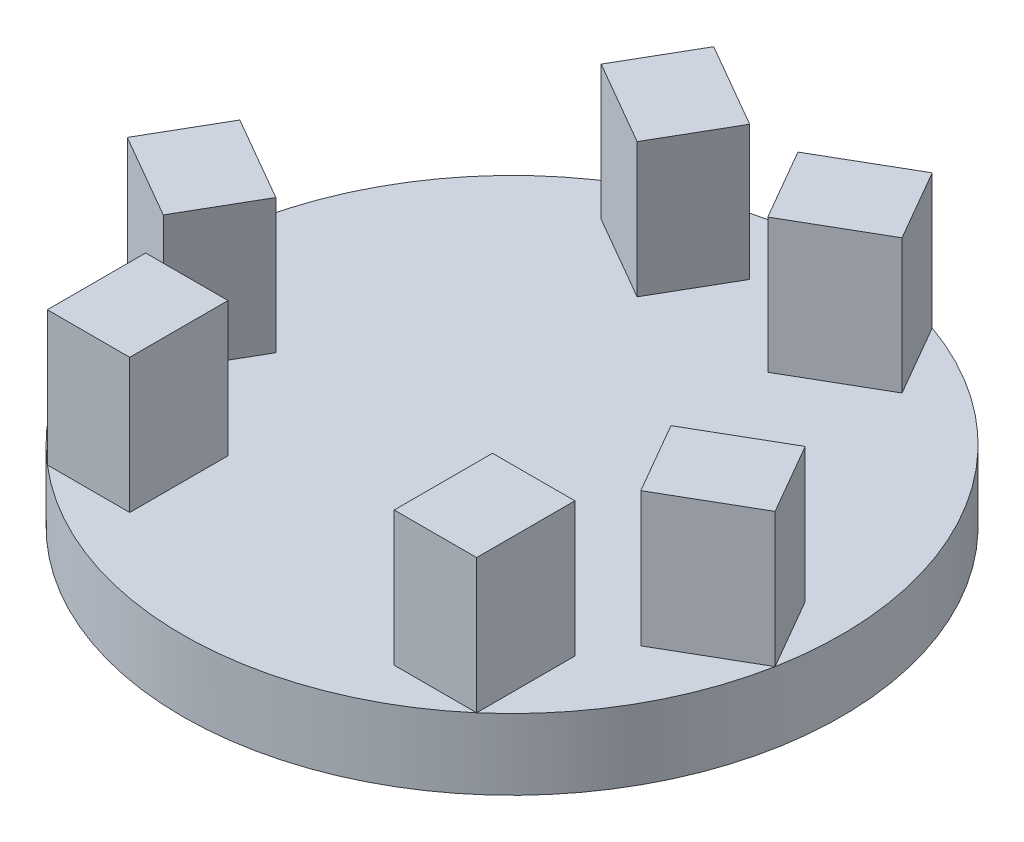
ISO-10303-21;
HEADER;
FILE_DESCRIPTION(('STEP AP214'),'2;1');
FILE_NAME('part.step','',(''),(''),'','','');
FILE_SCHEMA(('AUTOMOTIVE_DESIGN { 1 0 10303 214 1 1 1 1 }'));
ENDSEC;
DATA;
#1=APPLICATION_CONTEXT('core data for automotive mechanical design processes');
#2=APPLICATION_PROTOCOL_DEFINITION('international standard','automotive_design',2000,#1);
#3=PRODUCT_CONTEXT('',#1,'mechanical');
#4=PRODUCT('Part','Part','',(#3));
#5=PRODUCT_RELATED_PRODUCT_CATEGORY('part','',(#4));
#6=PRODUCT_DEFINITION_FORMATION('','',#4);
#7=PRODUCT_DEFINITION_CONTEXT('part definition',#1,'design');
#8=PRODUCT_DEFINITION('design','',#6,#7);
#9=PRODUCT_DEFINITION_SHAPE('','',#8);
#10=(LENGTH_UNIT() NAMED_UNIT(*) SI_UNIT(.MILLI.,.METRE.));
#11=(NAMED_UNIT(*) PLANE_ANGLE_UNIT() SI_UNIT($,.RADIAN.));
#12=(NAMED_UNIT(*) SI_UNIT($,.STERADIAN.) SOLID_ANGLE_UNIT());
#13=UNCERTAINTY_MEASURE_WITH_UNIT(LENGTH_MEASURE(1.E-05),#10,'distance_accuracy_value','');
#14=(GEOMETRIC_REPRESENTATION_CONTEXT(3) GLOBAL_UNCERTAINTY_ASSIGNED_CONTEXT((#13)) GLOBAL_UNIT_ASSIGNED_CONTEXT((#10,
#11,#12)) REPRESENTATION_CONTEXT('',''));
#15=CARTESIAN_POINT('',(0.,0.,0.));
#16=DIRECTION('',(0.,0.,1.));
#17=DIRECTION('',(1.,0.,0.));
#18=AXIS2_PLACEMENT_3D('',#15,#16,#17);
#19=CARTESIAN_POINT('',(0.,24.5,0.));
#20=DIRECTION('',(0.,1.,0.));
#21=DIRECTION('',(0.,0.,1.));
#22=AXIS2_PLACEMENT_3D('',#19,#20,#21);
#23=PLANE('',#22);
#24=DIRECTION('',(0.866025403784438,0.,-0.500000000000001));
#25=VECTOR('',#24,1.);
#26=CARTESIAN_POINT('',(22.5947751945729,24.5,-65.8726491717165));
#27=LINE('',#26,#25);
#28=CARTESIAN_POINT('',(22.5947751945729,24.5,-65.8726491717165));
#29=VERTEX_POINT('',#28);
#30=CARTESIAN_POINT('',(52.0396389232438,24.5,-82.8726491717165));
#31=VERTEX_POINT('',#30);
#32=EDGE_CURVE('E794',#29,#31,#27,.T.);
#33=ORIENTED_EDGE('',*,*,#32,.F.);
#34=DIRECTION('',(0.500000000000001,0.,0.866025403784438));
#35=VECTOR('',#34,1.);
#36=CARTESIAN_POINT('',(22.5947751945729,24.5,-65.8726491717165));
#37=LINE('',#36,#35);
#38=CARTESIAN_POINT('',(8.34477519457285,24.5,-90.554373179573));
#39=VERTEX_POINT('',#38);
#40=EDGE_CURVE('E229',#39,#29,#37,.T.);
#41=ORIENTED_EDGE('',*,*,#40,.F.);
#42=DIRECTION('',(-0.866025403784438,0.,0.500000000000001));
#43=VECTOR('',#42,1.);
#44=CARTESIAN_POINT('',(8.34477519457285,24.5,-90.554373179573));
#45=LINE('',#44,#43);
#46=CARTESIAN_POINT('',(37.7896389232437,24.5,-107.554373179573));
#47=VERTEX_POINT('',#46);
#48=EDGE_CURVE('E225',#47,#39,#45,.T.);
#49=ORIENTED_EDGE('',*,*,#48,.F.);
#50=CARTESIAN_POINT('',(0.,24.5,0.));
#51=DIRECTION('',(0.,1.,0.));
#52=DIRECTION('',(0.,0.,1.));
#53=AXIS2_PLACEMENT_3D('',#50,#51,#52);
#54=CIRCLE('',#53,114.);
#55=CARTESIAN_POINT('',(-37.7896389232438,24.5,-107.554373179573));
#56=VERTEX_POINT('',#55);
#57=EDGE_CURVE('E50',#47,#56,#54,.T.);
#58=ORIENTED_EDGE('',*,*,#57,.T.);
#59=DIRECTION('',(-0.866025403784439,0.,-0.5));
#60=VECTOR('',#59,1.);
#61=CARTESIAN_POINT('',(-8.34477519457291,24.5,-90.554373179573));
#62=LINE('',#61,#60);
#63=CARTESIAN_POINT('',(-8.34477519457291,24.5,-90.554373179573));
#64=VERTEX_POINT('',#63);
#65=EDGE_CURVE('E336',#64,#56,#62,.T.);
#66=ORIENTED_EDGE('',*,*,#65,.F.);
#67=DIRECTION('',(0.5,0.,-0.866025403784439));
#68=VECTOR('',#67,1.);
#69=CARTESIAN_POINT('',(-8.34477519457291,24.5,-90.554373179573));
#70=LINE('',#69,#68);
#71=CARTESIAN_POINT('',(-22.5947751945729,24.5,-65.8726491717165));
#72=VERTEX_POINT('',#71);
#73=EDGE_CURVE('E317',#72,#64,#70,.T.);
#74=ORIENTED_EDGE('',*,*,#73,.F.);
#75=DIRECTION('',(0.866025403784439,0.,0.5));
#76=VECTOR('',#75,1.);
#77=CARTESIAN_POINT('',(-22.5947751945729,24.5,-65.8726491717165));
#78=LINE('',#77,#76);
#79=CARTESIAN_POINT('',(-52.0396389232438,24.5,-82.8726491717165));
#80=VERTEX_POINT('',#79);
#81=EDGE_CURVE('E323',#80,#72,#78,.T.);
#82=ORIENTED_EDGE('',*,*,#81,.F.);
#83=DIRECTION('',(-0.5,0.,0.866025403784439));
#84=VECTOR('',#83,1.);
#85=CARTESIAN_POINT('',(-37.7896389232438,24.5,-107.554373179573));
#86=LINE('',#85,#84);
#87=EDGE_CURVE('E340',#56,#80,#86,.T.);
#88=ORIENTED_EDGE('',*,*,#87,.F.);
#89=CARTESIAN_POINT('',(-112.039638923244,24.5,21.0503992824162));
#90=VERTEX_POINT('',#89);
#91=EDGE_CURVE('E452',#56,#90,#54,.T.);
#92=ORIENTED_EDGE('',*,*,#91,.T.);
#93=DIRECTION('',(-0.5,0.,0.866025403784439));
#94=VECTOR('',#93,1.);
#95=CARTESIAN_POINT('',(-97.7896389232438,24.5,-3.63132472544033));
#96=LINE('',#95,#94);
#97=CARTESIAN_POINT('',(-97.7896389232438,24.5,-3.63132472544033));
#98=VERTEX_POINT('',#97);
#99=EDGE_CURVE('E298',#98,#90,#96,.T.);
#100=ORIENTED_EDGE('',*,*,#99,.F.);
#101=DIRECTION('',(-0.866025403784439,0.,-0.5));
#102=VECTOR('',#101,1.);
#103=CARTESIAN_POINT('',(-68.3447751945729,24.5,13.3686752745597));
#104=LINE('',#103,#102);
#105=CARTESIAN_POINT('',(-68.3447751945729,24.5,13.3686752745597));
#106=VERTEX_POINT('',#105);
#107=EDGE_CURVE('E295',#106,#98,#104,.T.);
#108=ORIENTED_EDGE('',*,*,#107,.F.);
#109=DIRECTION('',(0.5,0.,-0.866025403784439));
#110=VECTOR('',#109,1.);
#111=CARTESIAN_POINT('',(-68.3447751945729,24.5,13.3686752745597));
#112=LINE('',#111,#110);
#113=CARTESIAN_POINT('',(-82.5947751945729,24.5,38.0503992824162));
#114=VERTEX_POINT('',#113);
#115=EDGE_CURVE('E276',#114,#106,#112,.T.);
#116=ORIENTED_EDGE('',*,*,#115,.F.);
#117=DIRECTION('',(0.866025403784439,0.,0.5));
#118=VECTOR('',#117,1.);
#119=CARTESIAN_POINT('',(-82.5947751945729,24.5,38.0503992824162));
#120=LINE('',#119,#118);
#121=EDGE_CURVE('E282',#90,#114,#120,.T.);
#122=ORIENTED_EDGE('',*,*,#121,.F.);
#123=CARTESIAN_POINT('',(-74.25,24.5,86.5039738971569));
#124=VERTEX_POINT('',#123);
#125=EDGE_CURVE('E448',#90,#124,#54,.T.);
#126=ORIENTED_EDGE('',*,*,#125,.T.);
#127=DIRECTION('',(0.,0.,1.));
#128=VECTOR('',#127,1.);
#129=CARTESIAN_POINT('',(-74.25,24.5,52.5039738971569));
#130=LINE('',#129,#128);
#131=CARTESIAN_POINT('',(-74.25,24.5,52.5039738971569));
#132=VERTEX_POINT('',#131);
#133=EDGE_CURVE('E400',#132,#124,#130,.T.);
#134=ORIENTED_EDGE('',*,*,#133,.F.);
#135=DIRECTION('',(-1.,0.,0.));
#136=VECTOR('',#135,1.);
#137=CARTESIAN_POINT('',(-74.25,24.5,52.5039738971569));
#138=LINE('',#137,#136);
#139=CARTESIAN_POINT('',(-45.75,24.5,52.5039738971569));
#140=VERTEX_POINT('',#139);
#141=EDGE_CURVE('E406',#140,#132,#138,.T.);
#142=ORIENTED_EDGE('',*,*,#141,.F.);
#143=DIRECTION('',(0.,0.,-1.));
#144=VECTOR('',#143,1.);
#145=CARTESIAN_POINT('',(-45.75,24.5,52.5039738971569));
#146=LINE('',#145,#144);
#147=CARTESIAN_POINT('',(-45.75,24.5,86.5039738971569));
#148=VERTEX_POINT('',#147);
#149=EDGE_CURVE('E423',#148,#140,#146,.T.);
#150=ORIENTED_EDGE('',*,*,#149,.F.);
#151=DIRECTION('',(1.,0.,0.));
#152=VECTOR('',#151,1.);
#153=CARTESIAN_POINT('',(-74.25,24.5,86.5039738971569));
#154=LINE('',#153,#152);
#155=EDGE_CURVE('E419',#124,#148,#154,.T.);
#156=ORIENTED_EDGE('',*,*,#155,.F.);
#157=CARTESIAN_POINT('',(74.25,24.5,86.5039738971569));
#158=VERTEX_POINT('',#157);
#159=EDGE_CURVE('E11',#124,#158,#54,.T.);
#160=ORIENTED_EDGE('',*,*,#159,.T.);
#161=DIRECTION('',(1.,0.,0.));
#162=VECTOR('',#161,1.);
#163=CARTESIAN_POINT('',(45.75,24.5,86.5039738971569));
#164=LINE('',#163,#162);
#165=CARTESIAN_POINT('',(45.75,24.5,86.5039738971569));
#166=VERTEX_POINT('',#165);
#167=EDGE_CURVE('E378',#166,#158,#164,.T.);
#168=ORIENTED_EDGE('',*,*,#167,.F.);
#169=DIRECTION('',(0.,0.,1.));
#170=VECTOR('',#169,1.);
#171=CARTESIAN_POINT('',(45.75,24.5,52.5039738971569));
#172=LINE('',#171,#170);
#173=CARTESIAN_POINT('',(45.75,24.5,52.5039738971569));
#174=VERTEX_POINT('',#173);
#175=EDGE_CURVE('E359',#174,#166,#172,.T.);
#176=ORIENTED_EDGE('',*,*,#175,.F.);
#177=DIRECTION('',(-1.,0.,0.));
#178=VECTOR('',#177,1.);
#179=CARTESIAN_POINT('',(45.75,24.5,52.5039738971569));
#180=LINE('',#179,#178);
#181=CARTESIAN_POINT('',(74.25,24.5,52.5039738971569));
#182=VERTEX_POINT('',#181);
#183=EDGE_CURVE('E365',#182,#174,#180,.T.);
#184=ORIENTED_EDGE('',*,*,#183,.F.);
#185=DIRECTION('',(0.,0.,-1.));
#186=VECTOR('',#185,1.);
#187=CARTESIAN_POINT('',(74.25,24.5,52.5039738971569));
#188=LINE('',#187,#186);
#189=EDGE_CURVE('E381',#158,#182,#188,.T.);
#190=ORIENTED_EDGE('',*,*,#189,.F.);
#191=CARTESIAN_POINT('',(112.039638923244,24.5,21.0503992824161));
#192=VERTEX_POINT('',#191);
#193=EDGE_CURVE('E49',#158,#192,#54,.T.);
#194=ORIENTED_EDGE('',*,*,#193,.T.);
#195=DIRECTION('',(0.866025403784438,0.,-0.5));
#196=VECTOR('',#195,1.);
#197=CARTESIAN_POINT('',(82.5947751945729,24.5,38.0503992824161));
#198=LINE('',#197,#196);
#199=CARTESIAN_POINT('',(82.5947751945729,24.5,38.0503992824161));
#200=VERTEX_POINT('',#199);
#201=EDGE_CURVE('E237',#200,#192,#198,.T.);
#202=ORIENTED_EDGE('',*,*,#201,.F.);
#203=DIRECTION('',(0.5,0.,0.866025403784438));
#204=VECTOR('',#203,1.);
#205=CARTESIAN_POINT('',(82.5947751945729,24.5,38.0503992824161));
#206=LINE('',#205,#204);
#207=CARTESIAN_POINT('',(68.3447751945729,24.5,13.3686752745596));
#208=VERTEX_POINT('',#207);
#209=EDGE_CURVE('E232',#208,#200,#206,.T.);
#210=ORIENTED_EDGE('',*,*,#209,.F.);
#211=DIRECTION('',(-0.866025403784438,0.,0.5));
#212=VECTOR('',#211,1.);
#213=CARTESIAN_POINT('',(68.3447751945729,24.5,13.3686752745596));
#214=LINE('',#213,#212);
#215=CARTESIAN_POINT('',(97.7896389232438,24.5,-3.6313247254404));
#216=VERTEX_POINT('',#215);
#217=EDGE_CURVE('E247',#216,#208,#214,.T.);
#218=ORIENTED_EDGE('',*,*,#217,.F.);
#219=DIRECTION('',(-0.500000000000001,0.,-0.866025403784438));
#220=VECTOR('',#219,1.);
#221=CARTESIAN_POINT('',(112.039638923244,24.5,21.0503992824161));
#222=LINE('',#221,#220);
#223=EDGE_CURVE('E259',#192,#216,#222,.T.);
#224=ORIENTED_EDGE('',*,*,#223,.F.);
#225=EDGE_CURVE('E453',#192,#47,#54,.T.);
#226=ORIENTED_EDGE('',*,*,#225,.T.);
#227=DIRECTION('',(-0.500000000000001,0.,-0.866025403784438));
#228=VECTOR('',#227,1.);
#229=CARTESIAN_POINT('',(52.0396389232438,24.5,-82.8726491717165));
#230=LINE('',#229,#228);
#231=EDGE_CURVE('E790',#31,#47,#230,.T.);
#232=ORIENTED_EDGE('',*,*,#231,.F.);
#233=EDGE_LOOP('',(#33,#41,#49,#58,#66,#74,#82,#88,#92,#100,#108,#116,#122,#126,#134,#142,#150,
#156,#160,#168,#176,#184,#190,#194,#202,#210,#218,#224,#226,#232));
#234=FACE_BOUND('',#233,.T.);
#235=ADVANCED_FACE('F39',(#234),#23,.T.);
#236=CARTESIAN_POINT('',(0.,24.5,0.));
#237=DIRECTION('',(0.,-1.,0.));
#238=DIRECTION('',(0.,0.,-1.));
#239=AXIS2_PLACEMENT_3D('',#236,#237,#238);
#240=CYLINDRICAL_SURFACE('',#239,114.);
#241=ORIENTED_EDGE('',*,*,#159,.F.);
#242=ORIENTED_EDGE('',*,*,#125,.F.);
#243=ORIENTED_EDGE('',*,*,#91,.F.);
#244=ORIENTED_EDGE('',*,*,#57,.F.);
#245=ORIENTED_EDGE('',*,*,#225,.F.);
#246=ORIENTED_EDGE('',*,*,#193,.F.);
#247=EDGE_LOOP('',(#241,#242,#243,#244,#245,#246));
#248=FACE_BOUND('',#247,.T.);
#249=CARTESIAN_POINT('',(0.,0.,0.));
#250=DIRECTION('',(0.,1.,0.));
#251=DIRECTION('',(0.,0.,1.));
#252=AXIS2_PLACEMENT_3D('',#249,#250,#251);
#253=CIRCLE('',#252,114.);
#254=CARTESIAN_POINT('',(0.,0.,114.));
#255=VERTEX_POINT('',#254);
#256=EDGE_CURVE('E43',#255,#255,#253,.T.);
#257=ORIENTED_EDGE('',*,*,#256,.T.);
#258=EDGE_LOOP('',(#257));
#259=FACE_BOUND('',#258,.T.);
#260=ADVANCED_FACE('F41',(#248,#259),#240,.T.);
#261=CARTESIAN_POINT('',(0.,0.,0.));
#262=DIRECTION('',(0.,1.,0.));
#263=DIRECTION('',(0.,0.,1.));
#264=AXIS2_PLACEMENT_3D('',#261,#262,#263);
#265=PLANE('',#264);
#266=ORIENTED_EDGE('',*,*,#256,.F.);
#267=EDGE_LOOP('',(#266));
#268=FACE_BOUND('',#267,.T.);
#269=ADVANCED_FACE('F519',(#268),#265,.F.);
#270=CARTESIAN_POINT('',(-74.25,71.,52.5039738971569));
#271=DIRECTION('',(1.,0.,0.));
#272=DIRECTION('',(0.,0.,-1.));
#273=AXIS2_PLACEMENT_3D('',#270,#271,#272);
#274=PLANE('',#273);
#275=ORIENTED_EDGE('',*,*,#133,.T.);
#276=DIRECTION('',(0.,-1.,0.));
#277=VECTOR('',#276,1.);
#278=CARTESIAN_POINT('',(-74.25,71.,86.5039738971569));
#279=LINE('',#278,#277);
#280=CARTESIAN_POINT('',(-74.25,71.,86.5039738971569));
#281=VERTEX_POINT('',#280);
#282=EDGE_CURVE('E441',#281,#124,#279,.T.);
#283=ORIENTED_EDGE('',*,*,#282,.F.);
#284=DIRECTION('',(0.,0.,1.));
#285=VECTOR('',#284,1.);
#286=CARTESIAN_POINT('',(-74.25,71.,52.5039738971569));
#287=LINE('',#286,#285);
#288=CARTESIAN_POINT('',(-74.25,71.,52.5039738971569));
#289=VERTEX_POINT('',#288);
#290=EDGE_CURVE('E401',#289,#281,#287,.T.);
#291=ORIENTED_EDGE('',*,*,#290,.F.);
#292=DIRECTION('',(0.,-1.,0.));
#293=VECTOR('',#292,1.);
#294=CARTESIAN_POINT('',(-74.25,71.,52.5039738971569));
#295=LINE('',#294,#293);
#296=EDGE_CURVE('E415',#289,#132,#295,.T.);
#297=ORIENTED_EDGE('',*,*,#296,.T.);
#298=EDGE_LOOP('',(#275,#283,#291,#297));
#299=FACE_BOUND('',#298,.T.);
#300=ADVANCED_FACE('F501',(#299),#274,.F.);
#301=CARTESIAN_POINT('',(-74.25,71.,86.5039738971569));
#302=DIRECTION('',(0.,0.,-1.));
#303=DIRECTION('',(-1.,0.,0.));
#304=AXIS2_PLACEMENT_3D('',#301,#302,#303);
#305=PLANE('',#304);
#306=ORIENTED_EDGE('',*,*,#155,.T.);
#307=DIRECTION('',(0.,-1.,0.));
#308=VECTOR('',#307,1.);
#309=CARTESIAN_POINT('',(-45.75,71.,86.5039738971569));
#310=LINE('',#309,#308);
#311=CARTESIAN_POINT('',(-45.75,71.,86.5039738971569));
#312=VERTEX_POINT('',#311);
#313=EDGE_CURVE('E437',#312,#148,#310,.T.);
#314=ORIENTED_EDGE('',*,*,#313,.F.);
#315=DIRECTION('',(1.,0.,0.));
#316=VECTOR('',#315,1.);
#317=CARTESIAN_POINT('',(-74.25,71.,86.5039738971569));
#318=LINE('',#317,#316);
#319=EDGE_CURVE('E405',#281,#312,#318,.T.);
#320=ORIENTED_EDGE('',*,*,#319,.F.);
#321=ORIENTED_EDGE('',*,*,#282,.T.);
#322=EDGE_LOOP('',(#306,#314,#320,#321));
#323=FACE_BOUND('',#322,.T.);
#324=ADVANCED_FACE('F490',(#323),#305,.F.);
#325=CARTESIAN_POINT('',(-45.75,71.,52.5039738971569));
#326=DIRECTION('',(-1.,0.,0.));
#327=DIRECTION('',(0.,0.,1.));
#328=AXIS2_PLACEMENT_3D('',#325,#326,#327);
#329=PLANE('',#328);
#330=ORIENTED_EDGE('',*,*,#149,.T.);
#331=DIRECTION('',(0.,-1.,0.));
#332=VECTOR('',#331,1.);
#333=CARTESIAN_POINT('',(-45.75,71.,52.5039738971569));
#334=LINE('',#333,#332);
#335=CARTESIAN_POINT('',(-45.75,71.,52.5039738971569));
#336=VERTEX_POINT('',#335);
#337=EDGE_CURVE('E433',#336,#140,#334,.T.);
#338=ORIENTED_EDGE('',*,*,#337,.F.);
#339=DIRECTION('',(0.,0.,-1.));
#340=VECTOR('',#339,1.);
#341=CARTESIAN_POINT('',(-45.75,71.,52.5039738971569));
#342=LINE('',#341,#340);
#343=EDGE_CURVE('E409',#312,#336,#342,.T.);
#344=ORIENTED_EDGE('',*,*,#343,.F.);
#345=ORIENTED_EDGE('',*,*,#313,.T.);
#346=EDGE_LOOP('',(#330,#338,#344,#345));
#347=FACE_BOUND('',#346,.T.);
#348=ADVANCED_FACE('F493',(#347),#329,.F.);
#349=CARTESIAN_POINT('',(-74.25,71.,52.5039738971569));
#350=DIRECTION('',(0.,0.,1.));
#351=DIRECTION('',(1.,0.,0.));
#352=AXIS2_PLACEMENT_3D('',#349,#350,#351);
#353=PLANE('',#352);
#354=ORIENTED_EDGE('',*,*,#141,.T.);
#355=ORIENTED_EDGE('',*,*,#296,.F.);
#356=DIRECTION('',(-1.,0.,0.));
#357=VECTOR('',#356,1.);
#358=CARTESIAN_POINT('',(-74.25,71.,52.5039738971569));
#359=LINE('',#358,#357);
#360=EDGE_CURVE('E412',#336,#289,#359,.T.);
#361=ORIENTED_EDGE('',*,*,#360,.F.);
#362=ORIENTED_EDGE('',*,*,#337,.T.);
#363=EDGE_LOOP('',(#354,#355,#361,#362));
#364=FACE_BOUND('',#363,.T.);
#365=ADVANCED_FACE('F503',(#364),#353,.F.);
#366=CARTESIAN_POINT('',(0.,71.,0.));
#367=DIRECTION('',(0.,1.,0.));
#368=DIRECTION('',(0.,0.,1.));
#369=AXIS2_PLACEMENT_3D('',#366,#367,#368);
#370=PLANE('',#369);
#371=ORIENTED_EDGE('',*,*,#290,.T.);
#372=ORIENTED_EDGE('',*,*,#319,.T.);
#373=ORIENTED_EDGE('',*,*,#343,.T.);
#374=ORIENTED_EDGE('',*,*,#360,.T.);
#375=EDGE_LOOP('',(#371,#372,#373,#374));
#376=FACE_BOUND('',#375,.T.);
#377=ADVANCED_FACE('F497',(#376),#370,.T.);
#378=CARTESIAN_POINT('',(45.75,71.,52.5039738971569));
#379=DIRECTION('',(1.,0.,0.));
#380=DIRECTION('',(0.,0.,-1.));
#381=AXIS2_PLACEMENT_3D('',#378,#379,#380);
#382=PLANE('',#381);
#383=ORIENTED_EDGE('',*,*,#175,.T.);
#384=DIRECTION('',(0.,-1.,0.));
#385=VECTOR('',#384,1.);
#386=CARTESIAN_POINT('',(45.75,71.,86.5039738971569));
#387=LINE('',#386,#385);
#388=CARTESIAN_POINT('',(45.75,71.,86.5039738971569));
#389=VERTEX_POINT('',#388);
#390=EDGE_CURVE('E397',#389,#166,#387,.T.);
#391=ORIENTED_EDGE('',*,*,#390,.F.);
#392=DIRECTION('',(0.,0.,1.));
#393=VECTOR('',#392,1.);
#394=CARTESIAN_POINT('',(45.75,71.,52.5039738971569));
#395=LINE('',#394,#393);
#396=CARTESIAN_POINT('',(45.75,71.,52.5039738971569));
#397=VERTEX_POINT('',#396);
#398=EDGE_CURVE('E360',#397,#389,#395,.T.);
#399=ORIENTED_EDGE('',*,*,#398,.F.);
#400=DIRECTION('',(0.,-1.,0.));
#401=VECTOR('',#400,1.);
#402=CARTESIAN_POINT('',(45.75,71.,52.5039738971569));
#403=LINE('',#402,#401);
#404=EDGE_CURVE('E374',#397,#174,#403,.T.);
#405=ORIENTED_EDGE('',*,*,#404,.T.);
#406=EDGE_LOOP('',(#383,#391,#399,#405));
#407=FACE_BOUND('',#406,.T.);
#408=ADVANCED_FACE('F510',(#407),#382,.F.);
#409=CARTESIAN_POINT('',(45.75,71.,86.5039738971569));
#410=DIRECTION('',(0.,0.,-1.));
#411=DIRECTION('',(-1.,0.,0.));
#412=AXIS2_PLACEMENT_3D('',#409,#410,#411);
#413=PLANE('',#412);
#414=ORIENTED_EDGE('',*,*,#167,.T.);
#415=DIRECTION('',(0.,-1.,0.));
#416=VECTOR('',#415,1.);
#417=CARTESIAN_POINT('',(74.25,71.,86.5039738971569));
#418=LINE('',#417,#416);
#419=CARTESIAN_POINT('',(74.25,71.,86.5039738971569));
#420=VERTEX_POINT('',#419);
#421=EDGE_CURVE('E393',#420,#158,#418,.T.);
#422=ORIENTED_EDGE('',*,*,#421,.F.);
#423=DIRECTION('',(1.,0.,0.));
#424=VECTOR('',#423,1.);
#425=CARTESIAN_POINT('',(45.75,71.,86.5039738971569));
#426=LINE('',#425,#424);
#427=EDGE_CURVE('E364',#389,#420,#426,.T.);
#428=ORIENTED_EDGE('',*,*,#427,.F.);
#429=ORIENTED_EDGE('',*,*,#390,.T.);
#430=EDGE_LOOP('',(#414,#422,#428,#429));
#431=FACE_BOUND('',#430,.T.);
#432=ADVANCED_FACE('F556',(#431),#413,.F.);
#433=CARTESIAN_POINT('',(74.25,71.,52.5039738971569));
#434=DIRECTION('',(-1.,0.,0.));
#435=DIRECTION('',(0.,0.,1.));
#436=AXIS2_PLACEMENT_3D('',#433,#434,#435);
#437=PLANE('',#436);
#438=ORIENTED_EDGE('',*,*,#189,.T.);
#439=DIRECTION('',(0.,-1.,0.));
#440=VECTOR('',#439,1.);
#441=CARTESIAN_POINT('',(74.25,71.,52.5039738971569));
#442=LINE('',#441,#440);
#443=CARTESIAN_POINT('',(74.25,71.,52.5039738971569));
#444=VERTEX_POINT('',#443);
#445=EDGE_CURVE('E390',#444,#182,#442,.T.);
#446=ORIENTED_EDGE('',*,*,#445,.F.);
#447=DIRECTION('',(0.,0.,-1.));
#448=VECTOR('',#447,1.);
#449=CARTESIAN_POINT('',(74.25,71.,52.5039738971569));
#450=LINE('',#449,#448);
#451=EDGE_CURVE('E368',#420,#444,#450,.T.);
#452=ORIENTED_EDGE('',*,*,#451,.F.);
#453=ORIENTED_EDGE('',*,*,#421,.T.);
#454=EDGE_LOOP('',(#438,#446,#452,#453));
#455=FACE_BOUND('',#454,.T.);
#456=ADVANCED_FACE('F566',(#455),#437,.F.);
#457=CARTESIAN_POINT('',(45.75,71.,52.5039738971569));
#458=DIRECTION('',(0.,0.,1.));
#459=DIRECTION('',(1.,0.,0.));
#460=AXIS2_PLACEMENT_3D('',#457,#458,#459);
#461=PLANE('',#460);
#462=ORIENTED_EDGE('',*,*,#183,.T.);
#463=ORIENTED_EDGE('',*,*,#404,.F.);
#464=DIRECTION('',(-1.,0.,0.));
#465=VECTOR('',#464,1.);
#466=CARTESIAN_POINT('',(45.75,71.,52.5039738971569));
#467=LINE('',#466,#465);
#468=EDGE_CURVE('E371',#444,#397,#467,.T.);
#469=ORIENTED_EDGE('',*,*,#468,.F.);
#470=ORIENTED_EDGE('',*,*,#445,.T.);
#471=EDGE_LOOP('',(#462,#463,#469,#470));
#472=FACE_BOUND('',#471,.T.);
#473=ADVANCED_FACE('F576',(#472),#461,.F.);
#474=CARTESIAN_POINT('',(0.,71.,0.));
#475=DIRECTION('',(0.,1.,0.));
#476=DIRECTION('',(0.,0.,1.));
#477=AXIS2_PLACEMENT_3D('',#474,#475,#476);
#478=PLANE('',#477);
#479=ORIENTED_EDGE('',*,*,#398,.T.);
#480=ORIENTED_EDGE('',*,*,#427,.T.);
#481=ORIENTED_EDGE('',*,*,#451,.T.);
#482=ORIENTED_EDGE('',*,*,#468,.T.);
#483=EDGE_LOOP('',(#479,#480,#481,#482));
#484=FACE_BOUND('',#483,.T.);
#485=ADVANCED_FACE('F586',(#484),#478,.T.);
#486=CARTESIAN_POINT('',(-8.34477519457291,71.,-90.554373179573));
#487=DIRECTION('',(-0.866025403784439,0.,-0.5));
#488=DIRECTION('',(-0.5,0.,0.866025403784439));
#489=AXIS2_PLACEMENT_3D('',#486,#487,#488);
#490=PLANE('',#489);
#491=ORIENTED_EDGE('',*,*,#73,.T.);
#492=DIRECTION('',(0.,-1.,0.));
#493=VECTOR('',#492,1.);
#494=CARTESIAN_POINT('',(-8.34477519457291,71.,-90.554373179573));
#495=LINE('',#494,#493);
#496=CARTESIAN_POINT('',(-8.34477519457291,71.,-90.554373179573));
#497=VERTEX_POINT('',#496);
#498=EDGE_CURVE('E356',#497,#64,#495,.T.);
#499=ORIENTED_EDGE('',*,*,#498,.F.);
#500=DIRECTION('',(0.5,0.,-0.866025403784439));
#501=VECTOR('',#500,1.);
#502=CARTESIAN_POINT('',(-8.34477519457291,71.,-90.554373179573));
#503=LINE('',#502,#501);
#504=CARTESIAN_POINT('',(-22.5947751945729,71.,-65.8726491717165));
#505=VERTEX_POINT('',#504);
#506=EDGE_CURVE('E318',#505,#497,#503,.T.);
#507=ORIENTED_EDGE('',*,*,#506,.F.);
#508=DIRECTION('',(0.,-1.,0.));
#509=VECTOR('',#508,1.);
#510=CARTESIAN_POINT('',(-22.5947751945729,71.,-65.8726491717165));
#511=LINE('',#510,#509);
#512=EDGE_CURVE('E332',#505,#72,#511,.T.);
#513=ORIENTED_EDGE('',*,*,#512,.T.);
#514=EDGE_LOOP('',(#491,#499,#507,#513));
#515=FACE_BOUND('',#514,.T.);
#516=ADVANCED_FACE('F596',(#515),#490,.F.);
#517=CARTESIAN_POINT('',(-8.34477519457291,71.,-90.554373179573));
#518=DIRECTION('',(-0.5,0.,0.866025403784439));
#519=DIRECTION('',(0.866025403784439,0.,0.5));
#520=AXIS2_PLACEMENT_3D('',#517,#518,#519);
#521=PLANE('',#520);
#522=ORIENTED_EDGE('',*,*,#65,.T.);
#523=DIRECTION('',(0.,-1.,0.));
#524=VECTOR('',#523,1.);
#525=CARTESIAN_POINT('',(-37.7896389232438,71.,-107.554373179573));
#526=LINE('',#525,#524);
#527=CARTESIAN_POINT('',(-37.7896389232438,71.,-107.554373179573));
#528=VERTEX_POINT('',#527);
#529=EDGE_CURVE('E352',#528,#56,#526,.T.);
#530=ORIENTED_EDGE('',*,*,#529,.F.);
#531=DIRECTION('',(-0.866025403784439,0.,-0.5));
#532=VECTOR('',#531,1.);
#533=CARTESIAN_POINT('',(-8.34477519457291,71.,-90.554373179573));
#534=LINE('',#533,#532);
#535=EDGE_CURVE('E322',#497,#528,#534,.T.);
#536=ORIENTED_EDGE('',*,*,#535,.F.);
#537=ORIENTED_EDGE('',*,*,#498,.T.);
#538=EDGE_LOOP('',(#522,#530,#536,#537));
#539=FACE_BOUND('',#538,.T.);
#540=ADVANCED_FACE('F476',(#539),#521,.F.);
#541=CARTESIAN_POINT('',(-37.7896389232438,71.,-107.554373179573));
#542=DIRECTION('',(0.866025403784439,0.,0.5));
#543=DIRECTION('',(0.5,0.,-0.866025403784439));
#544=AXIS2_PLACEMENT_3D('',#541,#542,#543);
#545=PLANE('',#544);
#546=ORIENTED_EDGE('',*,*,#87,.T.);
#547=DIRECTION('',(0.,-1.,0.));
#548=VECTOR('',#547,1.);
#549=CARTESIAN_POINT('',(-52.0396389232438,71.,-82.8726491717165));
#550=LINE('',#549,#548);
#551=CARTESIAN_POINT('',(-52.0396389232438,71.,-82.8726491717165));
#552=VERTEX_POINT('',#551);
#553=EDGE_CURVE('E349',#552,#80,#550,.T.);
#554=ORIENTED_EDGE('',*,*,#553,.F.);
#555=DIRECTION('',(-0.5,0.,0.866025403784439));
#556=VECTOR('',#555,1.);
#557=CARTESIAN_POINT('',(-37.7896389232438,71.,-107.554373179573));
#558=LINE('',#557,#556);
#559=EDGE_CURVE('E326',#528,#552,#558,.T.);
#560=ORIENTED_EDGE('',*,*,#559,.F.);
#561=ORIENTED_EDGE('',*,*,#529,.T.);
#562=EDGE_LOOP('',(#546,#554,#560,#561));
#563=FACE_BOUND('',#562,.T.);
#564=ADVANCED_FACE('F481',(#563),#545,.F.);
#565=CARTESIAN_POINT('',(-22.5947751945729,71.,-65.8726491717165));
#566=DIRECTION('',(0.5,0.,-0.866025403784439));
#567=DIRECTION('',(-0.866025403784439,0.,-0.5));
#568=AXIS2_PLACEMENT_3D('',#565,#566,#567);
#569=PLANE('',#568);
#570=ORIENTED_EDGE('',*,*,#81,.T.);
#571=ORIENTED_EDGE('',*,*,#512,.F.);
#572=DIRECTION('',(0.866025403784439,0.,0.5));
#573=VECTOR('',#572,1.);
#574=CARTESIAN_POINT('',(-22.5947751945729,71.,-65.8726491717165));
#575=LINE('',#574,#573);
#576=EDGE_CURVE('E329',#552,#505,#575,.T.);
#577=ORIENTED_EDGE('',*,*,#576,.F.);
#578=ORIENTED_EDGE('',*,*,#553,.T.);
#579=EDGE_LOOP('',(#570,#571,#577,#578));
#580=FACE_BOUND('',#579,.T.);
#581=ADVANCED_FACE('F623',(#580),#569,.F.);
#582=CARTESIAN_POINT('',(0.,71.,0.));
#583=DIRECTION('',(0.,-1.,0.));
#584=DIRECTION('',(0.,0.,-1.));
#585=AXIS2_PLACEMENT_3D('',#582,#583,#584);
#586=PLANE('',#585);
#587=ORIENTED_EDGE('',*,*,#506,.T.);
#588=ORIENTED_EDGE('',*,*,#535,.T.);
#589=ORIENTED_EDGE('',*,*,#559,.T.);
#590=ORIENTED_EDGE('',*,*,#576,.T.);
#591=EDGE_LOOP('',(#587,#588,#589,#590));
#592=FACE_BOUND('',#591,.T.);
#593=ADVANCED_FACE('F632',(#592),#586,.F.);
#594=CARTESIAN_POINT('',(-68.3447751945729,71.,13.3686752745597));
#595=DIRECTION('',(-0.866025403784439,0.,-0.5));
#596=DIRECTION('',(-0.5,0.,0.866025403784439));
#597=AXIS2_PLACEMENT_3D('',#594,#595,#596);
#598=PLANE('',#597);
#599=ORIENTED_EDGE('',*,*,#115,.T.);
#600=DIRECTION('',(0.,-1.,0.));
#601=VECTOR('',#600,1.);
#602=CARTESIAN_POINT('',(-68.3447751945729,71.,13.3686752745597));
#603=LINE('',#602,#601);
#604=CARTESIAN_POINT('',(-68.3447751945729,71.,13.3686752745597));
#605=VERTEX_POINT('',#604);
#606=EDGE_CURVE('E314',#605,#106,#603,.T.);
#607=ORIENTED_EDGE('',*,*,#606,.F.);
#608=DIRECTION('',(0.5,0.,-0.866025403784439));
#609=VECTOR('',#608,1.);
#610=CARTESIAN_POINT('',(-68.3447751945729,71.,13.3686752745597));
#611=LINE('',#610,#609);
#612=CARTESIAN_POINT('',(-82.5947751945729,71.,38.0503992824162));
#613=VERTEX_POINT('',#612);
#614=EDGE_CURVE('E277',#613,#605,#611,.T.);
#615=ORIENTED_EDGE('',*,*,#614,.F.);
#616=DIRECTION('',(0.,-1.,0.));
#617=VECTOR('',#616,1.);
#618=CARTESIAN_POINT('',(-82.5947751945729,71.,38.0503992824162));
#619=LINE('',#618,#617);
#620=EDGE_CURVE('E291',#613,#114,#619,.T.);
#621=ORIENTED_EDGE('',*,*,#620,.T.);
#622=EDGE_LOOP('',(#599,#607,#615,#621));
#623=FACE_BOUND('',#622,.T.);
#624=ADVANCED_FACE('F642',(#623),#598,.F.);
#625=CARTESIAN_POINT('',(-68.3447751945729,71.,13.3686752745597));
#626=DIRECTION('',(-0.5,0.,0.866025403784439));
#627=DIRECTION('',(0.866025403784439,0.,0.5));
#628=AXIS2_PLACEMENT_3D('',#625,#626,#627);
#629=PLANE('',#628);
#630=ORIENTED_EDGE('',*,*,#107,.T.);
#631=DIRECTION('',(0.,-1.,0.));
#632=VECTOR('',#631,1.);
#633=CARTESIAN_POINT('',(-97.7896389232438,71.,-3.63132472544033));
#634=LINE('',#633,#632);
#635=CARTESIAN_POINT('',(-97.7896389232438,71.,-3.63132472544033));
#636=VERTEX_POINT('',#635);
#637=EDGE_CURVE('E310',#636,#98,#634,.T.);
#638=ORIENTED_EDGE('',*,*,#637,.F.);
#639=DIRECTION('',(-0.866025403784439,0.,-0.5));
#640=VECTOR('',#639,1.);
#641=CARTESIAN_POINT('',(-68.3447751945729,71.,13.3686752745597));
#642=LINE('',#641,#640);
#643=EDGE_CURVE('E281',#605,#636,#642,.T.);
#644=ORIENTED_EDGE('',*,*,#643,.F.);
#645=ORIENTED_EDGE('',*,*,#606,.T.);
#646=EDGE_LOOP('',(#630,#638,#644,#645));
#647=FACE_BOUND('',#646,.T.);
#648=ADVANCED_FACE('F652',(#647),#629,.F.);
#649=CARTESIAN_POINT('',(-97.7896389232438,71.,-3.63132472544033));
#650=DIRECTION('',(0.866025403784439,0.,0.5));
#651=DIRECTION('',(0.5,0.,-0.866025403784439));
#652=AXIS2_PLACEMENT_3D('',#649,#650,#651);
#653=PLANE('',#652);
#654=ORIENTED_EDGE('',*,*,#99,.T.);
#655=DIRECTION('',(0.,-1.,0.));
#656=VECTOR('',#655,1.);
#657=CARTESIAN_POINT('',(-112.039638923244,71.,21.0503992824162));
#658=LINE('',#657,#656);
#659=CARTESIAN_POINT('',(-112.039638923244,71.,21.0503992824162));
#660=VERTEX_POINT('',#659);
#661=EDGE_CURVE('E307',#660,#90,#658,.T.);
#662=ORIENTED_EDGE('',*,*,#661,.F.);
#663=DIRECTION('',(-0.5,0.,0.866025403784439));
#664=VECTOR('',#663,1.);
#665=CARTESIAN_POINT('',(-97.7896389232438,71.,-3.63132472544033));
#666=LINE('',#665,#664);
#667=EDGE_CURVE('E285',#636,#660,#666,.T.);
#668=ORIENTED_EDGE('',*,*,#667,.F.);
#669=ORIENTED_EDGE('',*,*,#637,.T.);
#670=EDGE_LOOP('',(#654,#662,#668,#669));
#671=FACE_BOUND('',#670,.T.);
#672=ADVANCED_FACE('F662',(#671),#653,.F.);
#673=CARTESIAN_POINT('',(-82.5947751945729,71.,38.0503992824162));
#674=DIRECTION('',(0.5,0.,-0.866025403784439));
#675=DIRECTION('',(-0.866025403784439,0.,-0.5));
#676=AXIS2_PLACEMENT_3D('',#673,#674,#675);
#677=PLANE('',#676);
#678=ORIENTED_EDGE('',*,*,#121,.T.);
#679=ORIENTED_EDGE('',*,*,#620,.F.);
#680=DIRECTION('',(0.866025403784439,0.,0.5));
#681=VECTOR('',#680,1.);
#682=CARTESIAN_POINT('',(-82.5947751945729,71.,38.0503992824162));
#683=LINE('',#682,#681);
#684=EDGE_CURVE('E288',#660,#613,#683,.T.);
#685=ORIENTED_EDGE('',*,*,#684,.F.);
#686=ORIENTED_EDGE('',*,*,#661,.T.);
#687=EDGE_LOOP('',(#678,#679,#685,#686));
#688=FACE_BOUND('',#687,.T.);
#689=ADVANCED_FACE('F672',(#688),#677,.F.);
#690=CARTESIAN_POINT('',(0.,71.,0.));
#691=DIRECTION('',(0.,-1.,0.));
#692=DIRECTION('',(0.,0.,-1.));
#693=AXIS2_PLACEMENT_3D('',#690,#691,#692);
#694=PLANE('',#693);
#695=ORIENTED_EDGE('',*,*,#614,.T.);
#696=ORIENTED_EDGE('',*,*,#643,.T.);
#697=ORIENTED_EDGE('',*,*,#667,.T.);
#698=ORIENTED_EDGE('',*,*,#684,.T.);
#699=EDGE_LOOP('',(#695,#696,#697,#698));
#700=FACE_BOUND('',#699,.T.);
#701=ADVANCED_FACE('F682',(#700),#694,.F.);
#702=CARTESIAN_POINT('',(82.5947751945729,71.,38.0503992824161));
#703=DIRECTION('',(0.866025403784438,0.,-0.5));
#704=DIRECTION('',(-0.500000000000001,0.,-0.866025403784438));
#705=AXIS2_PLACEMENT_3D('',#702,#703,#704);
#706=PLANE('',#705);
#707=ORIENTED_EDGE('',*,*,#209,.T.);
#708=DIRECTION('',(0.,-1.,0.));
#709=VECTOR('',#708,1.);
#710=CARTESIAN_POINT('',(82.5947751945729,71.,38.0503992824161));
#711=LINE('',#710,#709);
#712=CARTESIAN_POINT('',(82.5947751945729,71.,38.0503992824161));
#713=VERTEX_POINT('',#712);
#714=EDGE_CURVE('E273',#713,#200,#711,.T.);
#715=ORIENTED_EDGE('',*,*,#714,.F.);
#716=DIRECTION('',(0.5,0.,0.866025403784438));
#717=VECTOR('',#716,1.);
#718=CARTESIAN_POINT('',(82.5947751945729,71.,38.0503992824161));
#719=LINE('',#718,#717);
#720=CARTESIAN_POINT('',(68.3447751945729,71.,13.3686752745596));
#721=VERTEX_POINT('',#720);
#722=EDGE_CURVE('E242',#721,#713,#719,.T.);
#723=ORIENTED_EDGE('',*,*,#722,.F.);
#724=DIRECTION('',(0.,-1.,0.));
#725=VECTOR('',#724,1.);
#726=CARTESIAN_POINT('',(68.3447751945729,71.,13.3686752745596));
#727=LINE('',#726,#725);
#728=EDGE_CURVE('E255',#721,#208,#727,.T.);
#729=ORIENTED_EDGE('',*,*,#728,.T.);
#730=EDGE_LOOP('',(#707,#715,#723,#729));
#731=FACE_BOUND('',#730,.T.);
#732=ADVANCED_FACE('F692',(#731),#706,.F.);
#733=CARTESIAN_POINT('',(82.5947751945729,71.,38.0503992824161));
#734=DIRECTION('',(-0.5,0.,-0.866025403784438));
#735=DIRECTION('',(-0.866025403784439,0.,0.5));
#736=AXIS2_PLACEMENT_3D('',#733,#734,#735);
#737=PLANE('',#736);
#738=ORIENTED_EDGE('',*,*,#201,.T.);
#739=DIRECTION('',(0.,-1.,0.));
#740=VECTOR('',#739,1.);
#741=CARTESIAN_POINT('',(112.039638923244,71.,21.0503992824161));
#742=LINE('',#741,#740);
#743=CARTESIAN_POINT('',(112.039638923244,71.,21.0503992824161));
#744=VERTEX_POINT('',#743);
#745=EDGE_CURVE('E269',#744,#192,#742,.T.);
#746=ORIENTED_EDGE('',*,*,#745,.F.);
#747=DIRECTION('',(0.866025403784438,0.,-0.5));
#748=VECTOR('',#747,1.);
#749=CARTESIAN_POINT('',(82.5947751945729,71.,38.0503992824161));
#750=LINE('',#749,#748);
#751=EDGE_CURVE('E246',#713,#744,#750,.T.);
#752=ORIENTED_EDGE('',*,*,#751,.F.);
#753=ORIENTED_EDGE('',*,*,#714,.T.);
#754=EDGE_LOOP('',(#738,#746,#752,#753));
#755=FACE_BOUND('',#754,.T.);
#756=ADVANCED_FACE('F702',(#755),#737,.F.);
#757=CARTESIAN_POINT('',(112.039638923244,71.,21.0503992824161));
#758=DIRECTION('',(-0.866025403784438,0.,0.5));
#759=DIRECTION('',(0.500000000000001,0.,0.866025403784438));
#760=AXIS2_PLACEMENT_3D('',#757,#758,#759);
#761=PLANE('',#760);
#762=ORIENTED_EDGE('',*,*,#223,.T.);
#763=DIRECTION('',(0.,-1.,0.));
#764=VECTOR('',#763,1.);
#765=CARTESIAN_POINT('',(97.7896389232438,71.,-3.6313247254404));
#766=LINE('',#765,#764);
#767=CARTESIAN_POINT('',(97.7896389232438,71.,-3.6313247254404));
#768=VERTEX_POINT('',#767);
#769=EDGE_CURVE('E65',#768,#216,#766,.T.);
#770=ORIENTED_EDGE('',*,*,#769,.F.);
#771=DIRECTION('',(-0.500000000000001,0.,-0.866025403784438));
#772=VECTOR('',#771,1.);
#773=CARTESIAN_POINT('',(112.039638923244,71.,21.0503992824161));
#774=LINE('',#773,#772);
#775=EDGE_CURVE('E250',#744,#768,#774,.T.);
#776=ORIENTED_EDGE('',*,*,#775,.F.);
#777=ORIENTED_EDGE('',*,*,#745,.T.);
#778=EDGE_LOOP('',(#762,#770,#776,#777));
#779=FACE_BOUND('',#778,.T.);
#780=ADVANCED_FACE('F712',(#779),#761,.F.);
#781=CARTESIAN_POINT('',(68.3447751945729,71.,13.3686752745596));
#782=DIRECTION('',(0.5,0.,0.866025403784438));
#783=DIRECTION('',(0.866025403784439,0.,-0.5));
#784=AXIS2_PLACEMENT_3D('',#781,#782,#783);
#785=PLANE('',#784);
#786=ORIENTED_EDGE('',*,*,#217,.T.);
#787=ORIENTED_EDGE('',*,*,#728,.F.);
#788=DIRECTION('',(-0.866025403784438,0.,0.5));
#789=VECTOR('',#788,1.);
#790=CARTESIAN_POINT('',(68.3447751945729,71.,13.3686752745596));
#791=LINE('',#790,#789);
#792=EDGE_CURVE('E253',#768,#721,#791,.T.);
#793=ORIENTED_EDGE('',*,*,#792,.F.);
#794=ORIENTED_EDGE('',*,*,#769,.T.);
#795=EDGE_LOOP('',(#786,#787,#793,#794));
#796=FACE_BOUND('',#795,.T.);
#797=ADVANCED_FACE('F722',(#796),#785,.F.);
#798=CARTESIAN_POINT('',(0.,71.,0.));
#799=DIRECTION('',(0.,-1.,0.));
#800=DIRECTION('',(0.,0.,-1.));
#801=AXIS2_PLACEMENT_3D('',#798,#799,#800);
#802=PLANE('',#801);
#803=ORIENTED_EDGE('',*,*,#722,.T.);
#804=ORIENTED_EDGE('',*,*,#751,.T.);
#805=ORIENTED_EDGE('',*,*,#775,.T.);
#806=ORIENTED_EDGE('',*,*,#792,.T.);
#807=EDGE_LOOP('',(#803,#804,#805,#806));
#808=FACE_BOUND('',#807,.T.);
#809=ADVANCED_FACE('F732',(#808),#802,.F.);
#810=CARTESIAN_POINT('',(22.5947751945729,71.,-65.8726491717165));
#811=DIRECTION('',(0.866025403784438,0.,-0.5));
#812=DIRECTION('',(-0.500000000000001,0.,-0.866025403784438));
#813=AXIS2_PLACEMENT_3D('',#810,#811,#812);
#814=PLANE('',#813);
#815=ORIENTED_EDGE('',*,*,#40,.T.);
#816=DIRECTION('',(0.,-1.,0.));
#817=VECTOR('',#816,1.);
#818=CARTESIAN_POINT('',(22.5947751945729,71.,-65.8726491717165));
#819=LINE('',#818,#817);
#820=CARTESIAN_POINT('',(22.5947751945729,71.,-65.8726491717165));
#821=VERTEX_POINT('',#820);
#822=EDGE_CURVE('E208',#821,#29,#819,.T.);
#823=ORIENTED_EDGE('',*,*,#822,.F.);
#824=DIRECTION('',(0.500000000000001,0.,0.866025403784438));
#825=VECTOR('',#824,1.);
#826=CARTESIAN_POINT('',(22.5947751945729,71.,-65.8726491717165));
#827=LINE('',#826,#825);
#828=CARTESIAN_POINT('',(8.34477519457285,71.,-90.554373179573));
#829=VERTEX_POINT('',#828);
#830=EDGE_CURVE('E216',#829,#821,#827,.T.);
#831=ORIENTED_EDGE('',*,*,#830,.F.);
#832=DIRECTION('',(0.,-1.,0.));
#833=VECTOR('',#832,1.);
#834=CARTESIAN_POINT('',(8.34477519457285,71.,-90.554373179573));
#835=LINE('',#834,#833);
#836=EDGE_CURVE('E788',#829,#39,#835,.T.);
#837=ORIENTED_EDGE('',*,*,#836,.T.);
#838=EDGE_LOOP('',(#815,#823,#831,#837));
#839=FACE_BOUND('',#838,.T.);
#840=ADVANCED_FACE('F227',(#839),#814,.F.);
#841=CARTESIAN_POINT('',(22.5947751945729,71.,-65.8726491717165));
#842=DIRECTION('',(-0.500000000000001,0.,-0.866025403784438));
#843=DIRECTION('',(-0.866025403784438,0.,0.500000000000001));
#844=AXIS2_PLACEMENT_3D('',#841,#842,#843);
#845=PLANE('',#844);
#846=ORIENTED_EDGE('',*,*,#32,.T.);
#847=DIRECTION('',(0.,-1.,0.));
#848=VECTOR('',#847,1.);
#849=CARTESIAN_POINT('',(52.0396389232438,71.,-82.8726491717165));
#850=LINE('',#849,#848);
#851=CARTESIAN_POINT('',(52.0396389232438,71.,-82.8726491717165));
#852=VERTEX_POINT('',#851);
#853=EDGE_CURVE('E211',#852,#31,#850,.T.);
#854=ORIENTED_EDGE('',*,*,#853,.F.);
#855=DIRECTION('',(0.866025403784438,0.,-0.500000000000001));
#856=VECTOR('',#855,1.);
#857=CARTESIAN_POINT('',(22.5947751945729,71.,-65.8726491717165));
#858=LINE('',#857,#856);
#859=EDGE_CURVE('E204',#821,#852,#858,.T.);
#860=ORIENTED_EDGE('',*,*,#859,.F.);
#861=ORIENTED_EDGE('',*,*,#822,.T.);
#862=EDGE_LOOP('',(#846,#854,#860,#861));
#863=FACE_BOUND('',#862,.T.);
#864=ADVANCED_FACE('F206',(#863),#845,.F.);
#865=CARTESIAN_POINT('',(52.0396389232438,71.,-82.8726491717165));
#866=DIRECTION('',(-0.866025403784438,0.,0.500000000000001));
#867=DIRECTION('',(0.500000000000001,0.,0.866025403784438));
#868=AXIS2_PLACEMENT_3D('',#865,#866,#867);
#869=PLANE('',#868);
#870=ORIENTED_EDGE('',*,*,#231,.T.);
#871=DIRECTION('',(0.,-1.,0.));
#872=VECTOR('',#871,1.);
#873=CARTESIAN_POINT('',(37.7896389232437,71.,-107.554373179573));
#874=LINE('',#873,#872);
#875=CARTESIAN_POINT('',(37.7896389232437,71.,-107.554373179573));
#876=VERTEX_POINT('',#875);
#877=EDGE_CURVE('E57',#876,#47,#874,.T.);
#878=ORIENTED_EDGE('',*,*,#877,.F.);
#879=DIRECTION('',(-0.500000000000001,0.,-0.866025403784438));
#880=VECTOR('',#879,1.);
#881=CARTESIAN_POINT('',(52.0396389232438,71.,-82.8726491717165));
#882=LINE('',#881,#880);
#883=EDGE_CURVE('E215',#852,#876,#882,.T.);
#884=ORIENTED_EDGE('',*,*,#883,.F.);
#885=ORIENTED_EDGE('',*,*,#853,.T.);
#886=EDGE_LOOP('',(#870,#878,#884,#885));
#887=FACE_BOUND('',#886,.T.);
#888=ADVANCED_FACE('F758',(#887),#869,.F.);
#889=CARTESIAN_POINT('',(8.34477519457285,71.,-90.554373179573));
#890=DIRECTION('',(0.5,0.,0.866025403784438));
#891=DIRECTION('',(0.866025403784438,0.,-0.5));
#892=AXIS2_PLACEMENT_3D('',#889,#890,#891);
#893=PLANE('',#892);
#894=ORIENTED_EDGE('',*,*,#48,.T.);
#895=ORIENTED_EDGE('',*,*,#836,.F.);
#896=DIRECTION('',(-0.866025403784438,0.,0.500000000000001));
#897=VECTOR('',#896,1.);
#898=CARTESIAN_POINT('',(8.34477519457285,71.,-90.554373179573));
#899=LINE('',#898,#897);
#900=EDGE_CURVE('E220',#876,#829,#899,.T.);
#901=ORIENTED_EDGE('',*,*,#900,.F.);
#902=ORIENTED_EDGE('',*,*,#877,.T.);
#903=EDGE_LOOP('',(#894,#895,#901,#902));
#904=FACE_BOUND('',#903,.T.);
#905=ADVANCED_FACE('F767',(#904),#893,.F.);
#906=CARTESIAN_POINT('',(0.,71.,0.));
#907=DIRECTION('',(0.,-1.,0.));
#908=DIRECTION('',(0.,0.,-1.));
#909=AXIS2_PLACEMENT_3D('',#906,#907,#908);
#910=PLANE('',#909);
#911=ORIENTED_EDGE('',*,*,#830,.T.);
#912=ORIENTED_EDGE('',*,*,#859,.T.);
#913=ORIENTED_EDGE('',*,*,#883,.T.);
#914=ORIENTED_EDGE('',*,*,#900,.T.);
#915=EDGE_LOOP('',(#911,#912,#913,#914));
#916=FACE_BOUND('',#915,.T.);
#917=ADVANCED_FACE('F219',(#916),#910,.F.);
#918=CLOSED_SHELL('',(#235,#260,#269,#300,#324,#348,#365,#377,#408,#432,#456,#473,#485,#516,
#540,#564,#581,#593,#624,#648,#672,#689,#701,#732,#756,#780,#797,#809,#840,#864,#888,#905,#917));
#919=MANIFOLD_SOLID_BREP('B2',#918);
#920=ADVANCED_BREP_SHAPE_REPRESENTATION('',(#18,#919),#14);
#921=SHAPE_DEFINITION_REPRESENTATION(#9,#920);
ENDSEC;
END-ISO-10303-21;
